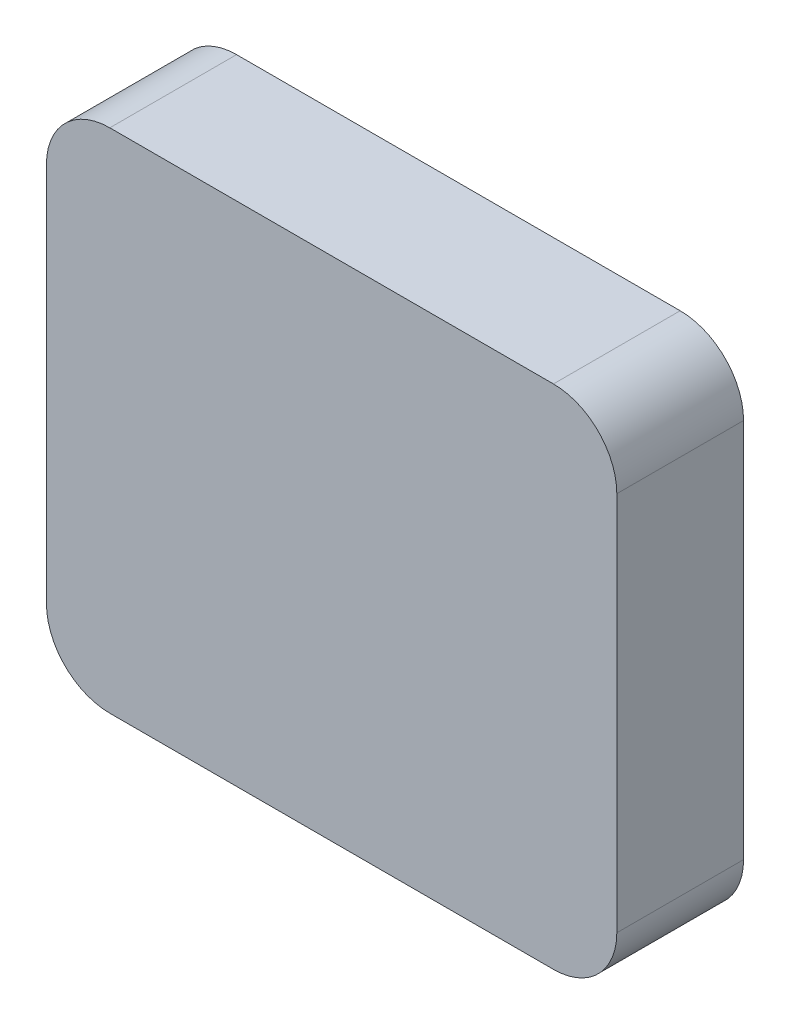
ISO-10303-21;
HEADER;
FILE_DESCRIPTION(('STEP AP214'),'2;1');
FILE_NAME('part.step','',(''),(''),'','','');
FILE_SCHEMA(('AUTOMOTIVE_DESIGN { 1 0 10303 214 1 1 1 1 }'));
ENDSEC;
DATA;
#1=APPLICATION_CONTEXT('core data for automotive mechanical design processes');
#2=APPLICATION_PROTOCOL_DEFINITION('international standard','automotive_design',2000,#1);
#3=PRODUCT_CONTEXT('',#1,'mechanical');
#4=PRODUCT('Part','Part','',(#3));
#5=PRODUCT_RELATED_PRODUCT_CATEGORY('part','',(#4));
#6=PRODUCT_DEFINITION_FORMATION('','',#4);
#7=PRODUCT_DEFINITION_CONTEXT('part definition',#1,'design');
#8=PRODUCT_DEFINITION('design','',#6,#7);
#9=PRODUCT_DEFINITION_SHAPE('','',#8);
#10=(LENGTH_UNIT() NAMED_UNIT(*) SI_UNIT(.MILLI.,.METRE.));
#11=(NAMED_UNIT(*) PLANE_ANGLE_UNIT() SI_UNIT($,.RADIAN.));
#12=(NAMED_UNIT(*) SI_UNIT($,.STERADIAN.) SOLID_ANGLE_UNIT());
#13=UNCERTAINTY_MEASURE_WITH_UNIT(LENGTH_MEASURE(1.E-05),#10,'distance_accuracy_value','');
#14=(GEOMETRIC_REPRESENTATION_CONTEXT(3) GLOBAL_UNCERTAINTY_ASSIGNED_CONTEXT((#13)) GLOBAL_UNIT_ASSIGNED_CONTEXT((#10,
#11,#12)) REPRESENTATION_CONTEXT('',''));
#15=CARTESIAN_POINT('',(0.,0.,0.));
#16=DIRECTION('',(0.,0.,1.));
#17=DIRECTION('',(1.,0.,0.));
#18=AXIS2_PLACEMENT_3D('',#15,#16,#17);
#19=CARTESIAN_POINT('',(101.6,88.9,0.));
#20=DIRECTION('',(0.,0.,1.));
#21=DIRECTION('',(1.,0.,0.));
#22=AXIS2_PLACEMENT_3D('',#19,#20,#21);
#23=PLANE('',#22);
#24=CARTESIAN_POINT('',(101.6,88.9,0.));
#25=DIRECTION('',(0.,0.,1.));
#26=DIRECTION('',(1.,0.,0.));
#27=AXIS2_PLACEMENT_3D('',#24,#25,#26);
#28=CIRCLE('',#27,12.7);
#29=CARTESIAN_POINT('',(114.3,88.9,0.));
#30=VERTEX_POINT('',#29);
#31=CARTESIAN_POINT('',(101.6,101.6,0.));
#32=VERTEX_POINT('',#31);
#33=EDGE_CURVE('E142',#30,#32,#28,.T.);
#34=ORIENTED_EDGE('',*,*,#33,.F.);
#35=DIRECTION('',(0.,1.,0.));
#36=VECTOR('',#35,1.);
#37=CARTESIAN_POINT('',(114.3,12.7,0.));
#38=LINE('',#37,#36);
#39=CARTESIAN_POINT('',(114.3,12.7,0.));
#40=VERTEX_POINT('',#39);
#41=EDGE_CURVE('E155',#40,#30,#38,.T.);
#42=ORIENTED_EDGE('',*,*,#41,.F.);
#43=CARTESIAN_POINT('',(101.6,12.7,0.));
#44=DIRECTION('',(0.,0.,1.));
#45=DIRECTION('',(-1.,0.,0.));
#46=AXIS2_PLACEMENT_3D('',#43,#44,#45);
#47=CIRCLE('',#46,12.7);
#48=CARTESIAN_POINT('',(101.6,0.,0.));
#49=VERTEX_POINT('',#48);
#50=EDGE_CURVE('E179',#49,#40,#47,.T.);
#51=ORIENTED_EDGE('',*,*,#50,.F.);
#52=DIRECTION('',(1.,0.,0.));
#53=VECTOR('',#52,1.);
#54=CARTESIAN_POINT('',(12.7,0.,0.));
#55=LINE('',#54,#53);
#56=CARTESIAN_POINT('',(12.7,0.,0.));
#57=VERTEX_POINT('',#56);
#58=EDGE_CURVE('E177',#57,#49,#55,.T.);
#59=ORIENTED_EDGE('',*,*,#58,.F.);
#60=CARTESIAN_POINT('',(12.7,12.7,0.));
#61=DIRECTION('',(0.,0.,1.));
#62=DIRECTION('',(1.,0.,0.));
#63=AXIS2_PLACEMENT_3D('',#60,#61,#62);
#64=CIRCLE('',#63,12.7);
#65=CARTESIAN_POINT('',(0.,12.7,0.));
#66=VERTEX_POINT('',#65);
#67=EDGE_CURVE('E175',#66,#57,#64,.T.);
#68=ORIENTED_EDGE('',*,*,#67,.F.);
#69=DIRECTION('',(0.,-1.,0.));
#70=VECTOR('',#69,1.);
#71=CARTESIAN_POINT('',(0.,12.7,0.));
#72=LINE('',#71,#70);
#73=CARTESIAN_POINT('',(0.,88.9,0.));
#74=VERTEX_POINT('',#73);
#75=EDGE_CURVE('E173',#74,#66,#72,.T.);
#76=ORIENTED_EDGE('',*,*,#75,.F.);
#77=CARTESIAN_POINT('',(12.7,88.9,0.));
#78=DIRECTION('',(0.,0.,1.));
#79=DIRECTION('',(-1.,0.,0.));
#80=AXIS2_PLACEMENT_3D('',#77,#78,#79);
#81=CIRCLE('',#80,12.7);
#82=CARTESIAN_POINT('',(12.7,101.6,0.));
#83=VERTEX_POINT('',#82);
#84=EDGE_CURVE('E171',#83,#74,#81,.T.);
#85=ORIENTED_EDGE('',*,*,#84,.F.);
#86=DIRECTION('',(-1.,0.,0.));
#87=VECTOR('',#86,1.);
#88=CARTESIAN_POINT('',(12.7,101.6,0.));
#89=LINE('',#88,#87);
#90=EDGE_CURVE('E145',#32,#83,#89,.T.);
#91=ORIENTED_EDGE('',*,*,#90,.F.);
#92=EDGE_LOOP('',(#34,#42,#51,#59,#68,#76,#85,#91));
#93=FACE_BOUND('',#92,.T.);
#94=DIRECTION('',(1.,0.,0.));
#95=VECTOR('',#94,1.);
#96=CARTESIAN_POINT('',(36.449,71.501,0.));
#97=LINE('',#96,#95);
#98=CARTESIAN_POINT('',(36.449,71.501,0.));
#99=VERTEX_POINT('',#98);
#100=CARTESIAN_POINT('',(77.851,71.501,0.));
#101=VERTEX_POINT('',#100);
#102=EDGE_CURVE('E141',#99,#101,#97,.T.);
#103=ORIENTED_EDGE('',*,*,#102,.F.);
#104=DIRECTION('',(0.,1.,0.));
#105=VECTOR('',#104,1.);
#106=CARTESIAN_POINT('',(36.449,71.501,0.));
#107=LINE('',#106,#105);
#108=CARTESIAN_POINT('',(36.449,30.099,0.));
#109=VERTEX_POINT('',#108);
#110=EDGE_CURVE('E138',#109,#99,#107,.T.);
#111=ORIENTED_EDGE('',*,*,#110,.F.);
#112=DIRECTION('',(-1.,0.,0.));
#113=VECTOR('',#112,1.);
#114=CARTESIAN_POINT('',(36.449,30.099,0.));
#115=LINE('',#114,#113);
#116=CARTESIAN_POINT('',(77.851,30.099,0.));
#117=VERTEX_POINT('',#116);
#118=EDGE_CURVE('E52',#117,#109,#115,.T.);
#119=ORIENTED_EDGE('',*,*,#118,.F.);
#120=DIRECTION('',(0.,-1.,0.));
#121=VECTOR('',#120,1.);
#122=CARTESIAN_POINT('',(77.851,71.501,0.));
#123=LINE('',#122,#121);
#124=EDGE_CURVE('E47',#101,#117,#123,.T.);
#125=ORIENTED_EDGE('',*,*,#124,.F.);
#126=EDGE_LOOP('',(#103,#111,#119,#125));
#127=FACE_BOUND('',#126,.T.);
#128=ADVANCED_FACE('F32',(#93,#127),#23,.F.);
#129=CARTESIAN_POINT('',(101.6,88.9,25.4));
#130=DIRECTION('',(0.,0.,-1.));
#131=DIRECTION('',(-1.,0.,0.));
#132=AXIS2_PLACEMENT_3D('',#129,#130,#131);
#133=CYLINDRICAL_SURFACE('',#132,12.7);
#134=ORIENTED_EDGE('',*,*,#33,.T.);
#135=DIRECTION('',(0.,0.,-1.));
#136=VECTOR('',#135,1.);
#137=CARTESIAN_POINT('',(101.6,101.6,25.4));
#138=LINE('',#137,#136);
#139=CARTESIAN_POINT('',(101.6,101.6,25.4));
#140=VERTEX_POINT('',#139);
#141=EDGE_CURVE('E11',#140,#32,#138,.T.);
#142=ORIENTED_EDGE('',*,*,#141,.F.);
#143=CARTESIAN_POINT('',(101.6,88.9,25.4));
#144=DIRECTION('',(0.,0.,1.));
#145=DIRECTION('',(1.,0.,0.));
#146=AXIS2_PLACEMENT_3D('',#143,#144,#145);
#147=CIRCLE('',#146,12.7);
#148=CARTESIAN_POINT('',(114.3,88.9,25.4));
#149=VERTEX_POINT('',#148);
#150=EDGE_CURVE('E151',#149,#140,#147,.T.);
#151=ORIENTED_EDGE('',*,*,#150,.F.);
#152=DIRECTION('',(0.,0.,-1.));
#153=VECTOR('',#152,1.);
#154=CARTESIAN_POINT('',(114.3,88.9,25.4));
#155=LINE('',#154,#153);
#156=EDGE_CURVE('E168',#149,#30,#155,.T.);
#157=ORIENTED_EDGE('',*,*,#156,.T.);
#158=EDGE_LOOP('',(#134,#142,#151,#157));
#159=FACE_BOUND('',#158,.T.);
#160=ADVANCED_FACE('F34',(#159),#133,.T.);
#161=CARTESIAN_POINT('',(12.7,101.6,25.4));
#162=DIRECTION('',(0.,-1.,0.));
#163=DIRECTION('',(0.,0.,-1.));
#164=AXIS2_PLACEMENT_3D('',#161,#162,#163);
#165=PLANE('',#164);
#166=ORIENTED_EDGE('',*,*,#90,.T.);
#167=DIRECTION('',(0.,0.,-1.));
#168=VECTOR('',#167,1.);
#169=CARTESIAN_POINT('',(12.7,101.6,25.4));
#170=LINE('',#169,#168);
#171=CARTESIAN_POINT('',(12.7,101.6,25.4));
#172=VERTEX_POINT('',#171);
#173=EDGE_CURVE('E40',#172,#83,#170,.T.);
#174=ORIENTED_EDGE('',*,*,#173,.F.);
#175=DIRECTION('',(-1.,0.,0.));
#176=VECTOR('',#175,1.);
#177=CARTESIAN_POINT('',(12.7,101.6,25.4));
#178=LINE('',#177,#176);
#179=EDGE_CURVE('E154',#140,#172,#178,.T.);
#180=ORIENTED_EDGE('',*,*,#179,.F.);
#181=ORIENTED_EDGE('',*,*,#141,.T.);
#182=EDGE_LOOP('',(#166,#174,#180,#181));
#183=FACE_BOUND('',#182,.T.);
#184=ADVANCED_FACE('F225',(#183),#165,.F.);
#185=CARTESIAN_POINT('',(12.7,88.9,25.4));
#186=DIRECTION('',(0.,0.,-1.));
#187=DIRECTION('',(-1.,0.,0.));
#188=AXIS2_PLACEMENT_3D('',#185,#186,#187);
#189=CYLINDRICAL_SURFACE('',#188,12.7);
#190=ORIENTED_EDGE('',*,*,#84,.T.);
#191=DIRECTION('',(0.,0.,-1.));
#192=VECTOR('',#191,1.);
#193=CARTESIAN_POINT('',(0.,88.9,25.4));
#194=LINE('',#193,#192);
#195=CARTESIAN_POINT('',(0.,88.9,25.4));
#196=VERTEX_POINT('',#195);
#197=EDGE_CURVE('E196',#196,#74,#194,.T.);
#198=ORIENTED_EDGE('',*,*,#197,.F.);
#199=CARTESIAN_POINT('',(12.7,88.9,25.4));
#200=DIRECTION('',(0.,0.,1.));
#201=DIRECTION('',(-1.,0.,0.));
#202=AXIS2_PLACEMENT_3D('',#199,#200,#201);
#203=CIRCLE('',#202,12.7);
#204=EDGE_CURVE('E157',#172,#196,#203,.T.);
#205=ORIENTED_EDGE('',*,*,#204,.F.);
#206=ORIENTED_EDGE('',*,*,#173,.T.);
#207=EDGE_LOOP('',(#190,#198,#205,#206));
#208=FACE_BOUND('',#207,.T.);
#209=ADVANCED_FACE('F203',(#208),#189,.T.);
#210=CARTESIAN_POINT('',(0.,12.7,25.4));
#211=DIRECTION('',(1.,0.,0.));
#212=DIRECTION('',(0.,0.,-1.));
#213=AXIS2_PLACEMENT_3D('',#210,#211,#212);
#214=PLANE('',#213);
#215=ORIENTED_EDGE('',*,*,#75,.T.);
#216=DIRECTION('',(0.,0.,-1.));
#217=VECTOR('',#216,1.);
#218=CARTESIAN_POINT('',(0.,12.7,25.4));
#219=LINE('',#218,#217);
#220=CARTESIAN_POINT('',(0.,12.7,25.4));
#221=VERTEX_POINT('',#220);
#222=EDGE_CURVE('E193',#221,#66,#219,.T.);
#223=ORIENTED_EDGE('',*,*,#222,.F.);
#224=DIRECTION('',(0.,-1.,0.));
#225=VECTOR('',#224,1.);
#226=CARTESIAN_POINT('',(0.,12.7,25.4));
#227=LINE('',#226,#225);
#228=EDGE_CURVE('E159',#196,#221,#227,.T.);
#229=ORIENTED_EDGE('',*,*,#228,.F.);
#230=ORIENTED_EDGE('',*,*,#197,.T.);
#231=EDGE_LOOP('',(#215,#223,#229,#230));
#232=FACE_BOUND('',#231,.T.);
#233=ADVANCED_FACE('F213',(#232),#214,.F.);
#234=CARTESIAN_POINT('',(12.7,12.7,25.4));
#235=DIRECTION('',(0.,0.,-1.));
#236=DIRECTION('',(-1.,0.,0.));
#237=AXIS2_PLACEMENT_3D('',#234,#235,#236);
#238=CYLINDRICAL_SURFACE('',#237,12.7);
#239=ORIENTED_EDGE('',*,*,#67,.T.);
#240=DIRECTION('',(0.,0.,-1.));
#241=VECTOR('',#240,1.);
#242=CARTESIAN_POINT('',(12.7,0.,25.4));
#243=LINE('',#242,#241);
#244=CARTESIAN_POINT('',(12.7,0.,25.4));
#245=VERTEX_POINT('',#244);
#246=EDGE_CURVE('E190',#245,#57,#243,.T.);
#247=ORIENTED_EDGE('',*,*,#246,.F.);
#248=CARTESIAN_POINT('',(12.7,12.7,25.4));
#249=DIRECTION('',(0.,0.,1.));
#250=DIRECTION('',(1.,0.,0.));
#251=AXIS2_PLACEMENT_3D('',#248,#249,#250);
#252=CIRCLE('',#251,12.7);
#253=EDGE_CURVE('E161',#221,#245,#252,.T.);
#254=ORIENTED_EDGE('',*,*,#253,.F.);
#255=ORIENTED_EDGE('',*,*,#222,.T.);
#256=EDGE_LOOP('',(#239,#247,#254,#255));
#257=FACE_BOUND('',#256,.T.);
#258=ADVANCED_FACE('F217',(#257),#238,.T.);
#259=CARTESIAN_POINT('',(12.7,0.,25.4));
#260=DIRECTION('',(0.,1.,0.));
#261=DIRECTION('',(0.,0.,1.));
#262=AXIS2_PLACEMENT_3D('',#259,#260,#261);
#263=PLANE('',#262);
#264=ORIENTED_EDGE('',*,*,#58,.T.);
#265=DIRECTION('',(0.,0.,-1.));
#266=VECTOR('',#265,1.);
#267=CARTESIAN_POINT('',(101.6,0.,25.4));
#268=LINE('',#267,#266);
#269=CARTESIAN_POINT('',(101.6,0.,25.4));
#270=VERTEX_POINT('',#269);
#271=EDGE_CURVE('E187',#270,#49,#268,.T.);
#272=ORIENTED_EDGE('',*,*,#271,.F.);
#273=DIRECTION('',(1.,0.,0.));
#274=VECTOR('',#273,1.);
#275=CARTESIAN_POINT('',(12.7,0.,25.4));
#276=LINE('',#275,#274);
#277=EDGE_CURVE('E163',#245,#270,#276,.T.);
#278=ORIENTED_EDGE('',*,*,#277,.F.);
#279=ORIENTED_EDGE('',*,*,#246,.T.);
#280=EDGE_LOOP('',(#264,#272,#278,#279));
#281=FACE_BOUND('',#280,.T.);
#282=ADVANCED_FACE('F238',(#281),#263,.F.);
#283=CARTESIAN_POINT('',(101.6,12.7,25.4));
#284=DIRECTION('',(0.,0.,-1.));
#285=DIRECTION('',(-1.,0.,0.));
#286=AXIS2_PLACEMENT_3D('',#283,#284,#285);
#287=CYLINDRICAL_SURFACE('',#286,12.7);
#288=ORIENTED_EDGE('',*,*,#50,.T.);
#289=DIRECTION('',(0.,0.,-1.));
#290=VECTOR('',#289,1.);
#291=CARTESIAN_POINT('',(114.3,12.7,25.4));
#292=LINE('',#291,#290);
#293=CARTESIAN_POINT('',(114.3,12.7,25.4));
#294=VERTEX_POINT('',#293);
#295=EDGE_CURVE('E184',#294,#40,#292,.T.);
#296=ORIENTED_EDGE('',*,*,#295,.F.);
#297=CARTESIAN_POINT('',(101.6,12.7,25.4));
#298=DIRECTION('',(0.,0.,1.));
#299=DIRECTION('',(-1.,0.,0.));
#300=AXIS2_PLACEMENT_3D('',#297,#298,#299);
#301=CIRCLE('',#300,12.7);
#302=EDGE_CURVE('E165',#270,#294,#301,.T.);
#303=ORIENTED_EDGE('',*,*,#302,.F.);
#304=ORIENTED_EDGE('',*,*,#271,.T.);
#305=EDGE_LOOP('',(#288,#296,#303,#304));
#306=FACE_BOUND('',#305,.T.);
#307=ADVANCED_FACE('F236',(#306),#287,.T.);
#308=CARTESIAN_POINT('',(114.3,12.7,25.4));
#309=DIRECTION('',(-1.,0.,0.));
#310=DIRECTION('',(0.,0.,1.));
#311=AXIS2_PLACEMENT_3D('',#308,#309,#310);
#312=PLANE('',#311);
#313=ORIENTED_EDGE('',*,*,#41,.T.);
#314=ORIENTED_EDGE('',*,*,#156,.F.);
#315=DIRECTION('',(0.,1.,0.));
#316=VECTOR('',#315,1.);
#317=CARTESIAN_POINT('',(114.3,12.7,25.4));
#318=LINE('',#317,#316);
#319=EDGE_CURVE('E167',#294,#149,#318,.T.);
#320=ORIENTED_EDGE('',*,*,#319,.F.);
#321=ORIENTED_EDGE('',*,*,#295,.T.);
#322=EDGE_LOOP('',(#313,#314,#320,#321));
#323=FACE_BOUND('',#322,.T.);
#324=ADVANCED_FACE('F231',(#323),#312,.F.);
#325=CARTESIAN_POINT('',(101.6,88.9,25.4));
#326=DIRECTION('',(0.,0.,1.));
#327=DIRECTION('',(1.,0.,0.));
#328=AXIS2_PLACEMENT_3D('',#325,#326,#327);
#329=PLANE('',#328);
#330=ORIENTED_EDGE('',*,*,#150,.T.);
#331=ORIENTED_EDGE('',*,*,#179,.T.);
#332=ORIENTED_EDGE('',*,*,#204,.T.);
#333=ORIENTED_EDGE('',*,*,#228,.T.);
#334=ORIENTED_EDGE('',*,*,#253,.T.);
#335=ORIENTED_EDGE('',*,*,#277,.T.);
#336=ORIENTED_EDGE('',*,*,#302,.T.);
#337=ORIENTED_EDGE('',*,*,#319,.T.);
#338=EDGE_LOOP('',(#330,#331,#332,#333,#334,#335,#336,#337));
#339=FACE_BOUND('',#338,.T.);
#340=ADVANCED_FACE('F221',(#339),#329,.T.);
#341=CARTESIAN_POINT('',(36.449,71.501,-25.4));
#342=DIRECTION('',(0.,-1.,0.));
#343=DIRECTION('',(0.,0.,-1.));
#344=AXIS2_PLACEMENT_3D('',#341,#342,#343);
#345=PLANE('',#344);
#346=ORIENTED_EDGE('',*,*,#102,.T.);
#347=DIRECTION('',(0.,0.,1.));
#348=VECTOR('',#347,1.);
#349=CARTESIAN_POINT('',(77.851,71.501,-25.4));
#350=LINE('',#349,#348);
#351=CARTESIAN_POINT('',(77.851,71.501,-25.4));
#352=VERTEX_POINT('',#351);
#353=EDGE_CURVE('E122',#352,#101,#350,.T.);
#354=ORIENTED_EDGE('',*,*,#353,.F.);
#355=DIRECTION('',(1.,0.,0.));
#356=VECTOR('',#355,1.);
#357=CARTESIAN_POINT('',(36.449,71.501,-25.4));
#358=LINE('',#357,#356);
#359=CARTESIAN_POINT('',(36.449,71.501,-25.4));
#360=VERTEX_POINT('',#359);
#361=EDGE_CURVE('E129',#360,#352,#358,.T.);
#362=ORIENTED_EDGE('',*,*,#361,.F.);
#363=DIRECTION('',(0.,0.,1.));
#364=VECTOR('',#363,1.);
#365=CARTESIAN_POINT('',(36.449,71.501,-25.4));
#366=LINE('',#365,#364);
#367=EDGE_CURVE('E297',#360,#99,#366,.T.);
#368=ORIENTED_EDGE('',*,*,#367,.T.);
#369=EDGE_LOOP('',(#346,#354,#362,#368));
#370=FACE_BOUND('',#369,.T.);
#371=ADVANCED_FACE('F140',(#370),#345,.F.);
#372=CARTESIAN_POINT('',(77.851,71.501,-25.4));
#373=DIRECTION('',(-1.,0.,0.));
#374=DIRECTION('',(0.,0.,1.));
#375=AXIS2_PLACEMENT_3D('',#372,#373,#374);
#376=PLANE('',#375);
#377=ORIENTED_EDGE('',*,*,#124,.T.);
#378=DIRECTION('',(0.,0.,1.));
#379=VECTOR('',#378,1.);
#380=CARTESIAN_POINT('',(77.851,30.099,-25.4));
#381=LINE('',#380,#379);
#382=CARTESIAN_POINT('',(77.851,30.099,-25.4));
#383=VERTEX_POINT('',#382);
#384=EDGE_CURVE('E125',#383,#117,#381,.T.);
#385=ORIENTED_EDGE('',*,*,#384,.F.);
#386=DIRECTION('',(0.,-1.,0.));
#387=VECTOR('',#386,1.);
#388=CARTESIAN_POINT('',(77.851,71.501,-25.4));
#389=LINE('',#388,#387);
#390=EDGE_CURVE('E118',#352,#383,#389,.T.);
#391=ORIENTED_EDGE('',*,*,#390,.F.);
#392=ORIENTED_EDGE('',*,*,#353,.T.);
#393=EDGE_LOOP('',(#377,#385,#391,#392));
#394=FACE_BOUND('',#393,.T.);
#395=ADVANCED_FACE('F120',(#394),#376,.F.);
#396=CARTESIAN_POINT('',(36.449,30.099,-25.4));
#397=DIRECTION('',(0.,1.,0.));
#398=DIRECTION('',(-1.,0.,0.));
#399=AXIS2_PLACEMENT_3D('',#396,#397,#398);
#400=PLANE('',#399);
#401=ORIENTED_EDGE('',*,*,#118,.T.);
#402=DIRECTION('',(0.,0.,1.));
#403=VECTOR('',#402,1.);
#404=CARTESIAN_POINT('',(36.449,30.099,-25.4));
#405=LINE('',#404,#403);
#406=CARTESIAN_POINT('',(36.449,30.099,-25.4));
#407=VERTEX_POINT('',#406);
#408=EDGE_CURVE('E147',#407,#109,#405,.T.);
#409=ORIENTED_EDGE('',*,*,#408,.F.);
#410=DIRECTION('',(-1.,0.,0.));
#411=VECTOR('',#410,1.);
#412=CARTESIAN_POINT('',(36.449,30.099,-25.4));
#413=LINE('',#412,#411);
#414=EDGE_CURVE('E128',#383,#407,#413,.T.);
#415=ORIENTED_EDGE('',*,*,#414,.F.);
#416=ORIENTED_EDGE('',*,*,#384,.T.);
#417=EDGE_LOOP('',(#401,#409,#415,#416));
#418=FACE_BOUND('',#417,.T.);
#419=ADVANCED_FACE('F265',(#418),#400,.F.);
#420=CARTESIAN_POINT('',(36.449,71.501,-25.4));
#421=DIRECTION('',(1.,0.,0.));
#422=DIRECTION('',(0.,0.,-1.));
#423=AXIS2_PLACEMENT_3D('',#420,#421,#422);
#424=PLANE('',#423);
#425=ORIENTED_EDGE('',*,*,#110,.T.);
#426=ORIENTED_EDGE('',*,*,#367,.F.);
#427=DIRECTION('',(0.,1.,0.));
#428=VECTOR('',#427,1.);
#429=CARTESIAN_POINT('',(36.449,71.501,-25.4));
#430=LINE('',#429,#428);
#431=EDGE_CURVE('E134',#407,#360,#430,.T.);
#432=ORIENTED_EDGE('',*,*,#431,.F.);
#433=ORIENTED_EDGE('',*,*,#408,.T.);
#434=EDGE_LOOP('',(#425,#426,#432,#433));
#435=FACE_BOUND('',#434,.T.);
#436=ADVANCED_FACE('F270',(#435),#424,.F.);
#437=CARTESIAN_POINT('',(0.,0.,-25.4));
#438=DIRECTION('',(0.,0.,-1.));
#439=DIRECTION('',(-1.,0.,0.));
#440=AXIS2_PLACEMENT_3D('',#437,#438,#439);
#441=PLANE('',#440);
#442=CARTESIAN_POINT('',(57.15,50.8,-25.4));
#443=DIRECTION('',(0.,0.,-1.));
#444=DIRECTION('',(-1.,0.,0.));
#445=AXIS2_PLACEMENT_3D('',#442,#443,#444);
#446=CIRCLE('',#445,7.112);
#447=CARTESIAN_POINT('',(50.038,50.8,-25.4));
#448=VERTEX_POINT('',#447);
#449=EDGE_CURVE('E290',#448,#448,#446,.T.);
#450=ORIENTED_EDGE('',*,*,#449,.F.);
#451=EDGE_LOOP('',(#450));
#452=FACE_BOUND('',#451,.T.);
#453=ORIENTED_EDGE('',*,*,#361,.T.);
#454=ORIENTED_EDGE('',*,*,#390,.T.);
#455=ORIENTED_EDGE('',*,*,#414,.T.);
#456=ORIENTED_EDGE('',*,*,#431,.T.);
#457=EDGE_LOOP('',(#453,#454,#455,#456));
#458=FACE_BOUND('',#457,.T.);
#459=ADVANCED_FACE('F132',(#452,#458),#441,.T.);
#460=CARTESIAN_POINT('',(57.15,50.8,0.));
#461=DIRECTION('',(0.,0.,-1.));
#462=DIRECTION('',(-1.,0.,0.));
#463=AXIS2_PLACEMENT_3D('',#460,#461,#462);
#464=CYLINDRICAL_SURFACE('',#463,7.112);
#465=CARTESIAN_POINT('',(57.15,50.8,0.));
#466=DIRECTION('',(0.,0.,-1.));
#467=DIRECTION('',(-1.,0.,0.));
#468=AXIS2_PLACEMENT_3D('',#465,#466,#467);
#469=CIRCLE('',#468,7.112);
#470=CARTESIAN_POINT('',(50.038,50.8,0.));
#471=VERTEX_POINT('',#470);
#472=EDGE_CURVE('E289',#471,#471,#469,.T.);
#473=ORIENTED_EDGE('',*,*,#472,.F.);
#474=EDGE_LOOP('',(#473));
#475=FACE_BOUND('',#474,.T.);
#476=ORIENTED_EDGE('',*,*,#449,.T.);
#477=EDGE_LOOP('',(#476));
#478=FACE_BOUND('',#477,.T.);
#479=ADVANCED_FACE('F277',(#475,#478),#464,.F.);
#480=CARTESIAN_POINT('',(57.15,50.8,0.));
#481=DIRECTION('',(0.,0.,-1.));
#482=DIRECTION('',(-1.,0.,0.));
#483=AXIS2_PLACEMENT_3D('',#480,#481,#482);
#484=PLANE('',#483);
#485=ORIENTED_EDGE('',*,*,#472,.T.);
#486=EDGE_LOOP('',(#485));
#487=FACE_BOUND('',#486,.T.);
#488=ADVANCED_FACE('F281',(#487),#484,.T.);
#489=CLOSED_SHELL('',(#128,#160,#184,#209,#233,#258,#282,#307,#324,#340,#371,#395,#419,#436,
#459,#479,#488));
#490=MANIFOLD_SOLID_BREP('B2',#489);
#491=ADVANCED_BREP_SHAPE_REPRESENTATION('',(#18,#490),#14);
#492=SHAPE_DEFINITION_REPRESENTATION(#9,#491);
ENDSEC;
END-ISO-10303-21;
